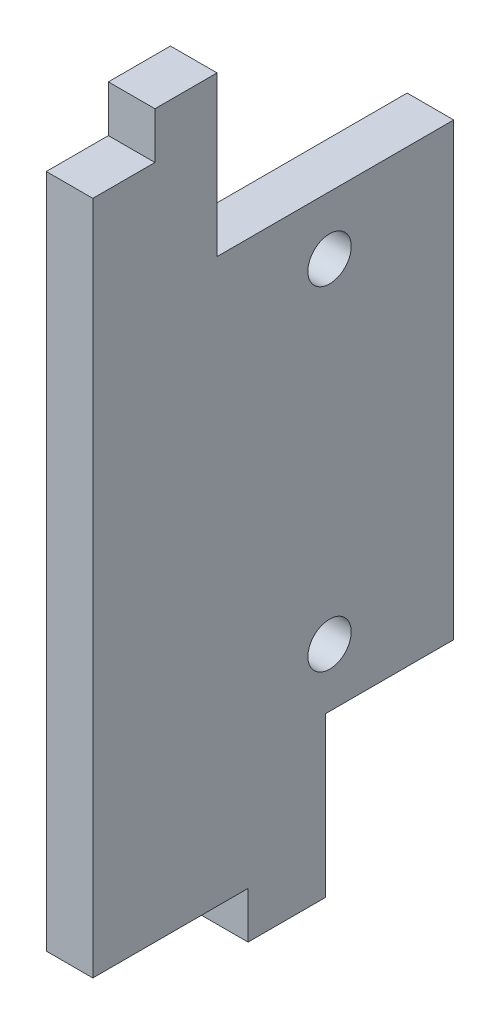
ISO-10303-21;
HEADER;
FILE_DESCRIPTION(('STEP AP214'),'2;1');
FILE_NAME('part.step','',(''),(''),'','','');
FILE_SCHEMA(('AUTOMOTIVE_DESIGN { 1 0 10303 214 1 1 1 1 }'));
ENDSEC;
DATA;
#1=APPLICATION_CONTEXT('core data for automotive mechanical design processes');
#2=APPLICATION_PROTOCOL_DEFINITION('international standard','automotive_design',2000,#1);
#3=PRODUCT_CONTEXT('',#1,'mechanical');
#4=PRODUCT('Part','Part','',(#3));
#5=PRODUCT_RELATED_PRODUCT_CATEGORY('part','',(#4));
#6=PRODUCT_DEFINITION_FORMATION('','',#4);
#7=PRODUCT_DEFINITION_CONTEXT('part definition',#1,'design');
#8=PRODUCT_DEFINITION('design','',#6,#7);
#9=PRODUCT_DEFINITION_SHAPE('','',#8);
#10=(LENGTH_UNIT() NAMED_UNIT(*) SI_UNIT(.MILLI.,.METRE.));
#11=(NAMED_UNIT(*) PLANE_ANGLE_UNIT() SI_UNIT($,.RADIAN.));
#12=(NAMED_UNIT(*) SI_UNIT($,.STERADIAN.) SOLID_ANGLE_UNIT());
#13=UNCERTAINTY_MEASURE_WITH_UNIT(LENGTH_MEASURE(1.E-05),#10,'distance_accuracy_value','');
#14=(GEOMETRIC_REPRESENTATION_CONTEXT(3) GLOBAL_UNCERTAINTY_ASSIGNED_CONTEXT((#13)) GLOBAL_UNIT_ASSIGNED_CONTEXT((#10,
#11,#12)) REPRESENTATION_CONTEXT('',''));
#15=CARTESIAN_POINT('',(0.,0.,0.));
#16=DIRECTION('',(0.,0.,1.));
#17=DIRECTION('',(1.,0.,0.));
#18=AXIS2_PLACEMENT_3D('',#15,#16,#17);
#19=CARTESIAN_POINT('',(3.,-24.75,-7.5));
#20=DIRECTION('',(0.,0.,1.));
#21=DIRECTION('',(1.,0.,0.));
#22=AXIS2_PLACEMENT_3D('',#19,#20,#21);
#23=PLANE('',#22);
#24=DIRECTION('',(-1.,0.,0.));
#25=VECTOR('',#24,1.);
#26=CARTESIAN_POINT('',(3.,-14.5,-7.5));
#27=LINE('',#26,#25);
#28=CARTESIAN_POINT('',(3.,-14.5,-7.5));
#29=VERTEX_POINT('',#28);
#30=CARTESIAN_POINT('',(0.,-14.5,-7.5));
#31=VERTEX_POINT('',#30);
#32=EDGE_CURVE('E52',#29,#31,#27,.T.);
#33=ORIENTED_EDGE('',*,*,#32,.F.);
#34=DIRECTION('',(0.,1.,0.));
#35=VECTOR('',#34,1.);
#36=CARTESIAN_POINT('',(3.,-24.75,-7.5));
#37=LINE('',#36,#35);
#38=CARTESIAN_POINT('',(3.,-24.75,-7.5));
#39=VERTEX_POINT('',#38);
#40=EDGE_CURVE('E151',#39,#29,#37,.T.);
#41=ORIENTED_EDGE('',*,*,#40,.F.);
#42=DIRECTION('',(-1.,0.,0.));
#43=VECTOR('',#42,1.);
#44=CARTESIAN_POINT('',(3.,-24.75,-7.5));
#45=LINE('',#44,#43);
#46=CARTESIAN_POINT('',(0.,-24.75,-7.5));
#47=VERTEX_POINT('',#46);
#48=EDGE_CURVE('E11',#39,#47,#45,.T.);
#49=ORIENTED_EDGE('',*,*,#48,.T.);
#50=DIRECTION('',(0.,1.,0.));
#51=VECTOR('',#50,1.);
#52=CARTESIAN_POINT('',(0.,-24.75,-7.5));
#53=LINE('',#52,#51);
#54=EDGE_CURVE('E218',#47,#31,#53,.T.);
#55=ORIENTED_EDGE('',*,*,#54,.T.);
#56=EDGE_LOOP('',(#33,#41,#49,#55));
#57=FACE_BOUND('',#56,.T.);
#58=ADVANCED_FACE('F37',(#57),#23,.F.);
#59=CARTESIAN_POINT('',(3.,-24.75,7.5));
#60=DIRECTION('',(0.,0.,-1.));
#61=DIRECTION('',(-1.,0.,0.));
#62=AXIS2_PLACEMENT_3D('',#59,#60,#61);
#63=PLANE('',#62);
#64=DIRECTION('',(0.,-1.,0.));
#65=VECTOR('',#64,1.);
#66=CARTESIAN_POINT('',(3.,-24.75,7.5));
#67=LINE('',#66,#65);
#68=CARTESIAN_POINT('',(3.,21.75,7.5));
#69=VERTEX_POINT('',#68);
#70=CARTESIAN_POINT('',(3.,-21.75,7.5));
#71=VERTEX_POINT('',#70);
#72=EDGE_CURVE('E205',#69,#71,#67,.T.);
#73=ORIENTED_EDGE('',*,*,#72,.F.);
#74=DIRECTION('',(-1.,0.,0.));
#75=VECTOR('',#74,1.);
#76=CARTESIAN_POINT('',(3.,21.75,7.5));
#77=LINE('',#76,#75);
#78=CARTESIAN_POINT('',(0.,21.75,7.5));
#79=VERTEX_POINT('',#78);
#80=EDGE_CURVE('E170',#69,#79,#77,.T.);
#81=ORIENTED_EDGE('',*,*,#80,.T.);
#82=DIRECTION('',(0.,-1.,0.));
#83=VECTOR('',#82,1.);
#84=CARTESIAN_POINT('',(0.,-24.75,7.5));
#85=LINE('',#84,#83);
#86=CARTESIAN_POINT('',(0.,-21.75,7.5));
#87=VERTEX_POINT('',#86);
#88=EDGE_CURVE('E203',#79,#87,#85,.T.);
#89=ORIENTED_EDGE('',*,*,#88,.T.);
#90=DIRECTION('',(-1.,0.,0.));
#91=VECTOR('',#90,1.);
#92=CARTESIAN_POINT('',(3.,-21.75,7.5));
#93=LINE('',#92,#91);
#94=EDGE_CURVE('E166',#71,#87,#93,.T.);
#95=ORIENTED_EDGE('',*,*,#94,.F.);
#96=EDGE_LOOP('',(#73,#81,#89,#95));
#97=FACE_BOUND('',#96,.T.);
#98=ADVANCED_FACE('F39',(#97),#63,.F.);
#99=CARTESIAN_POINT('',(3.,-24.75,7.5));
#100=DIRECTION('',(0.,1.,0.));
#101=DIRECTION('',(0.,0.,1.));
#102=AXIS2_PLACEMENT_3D('',#99,#100,#101);
#103=PLANE('',#102);
#104=DIRECTION('',(0.,0.,-1.));
#105=VECTOR('',#104,1.);
#106=CARTESIAN_POINT('',(3.,-24.75,7.5));
#107=LINE('',#106,#105);
#108=CARTESIAN_POINT('',(3.,-24.75,-2.5));
#109=VERTEX_POINT('',#108);
#110=EDGE_CURVE('E208',#109,#39,#107,.T.);
#111=ORIENTED_EDGE('',*,*,#110,.F.);
#112=DIRECTION('',(-1.,0.,0.));
#113=VECTOR('',#112,1.);
#114=CARTESIAN_POINT('',(3.,-24.75,-2.5));
#115=LINE('',#114,#113);
#116=CARTESIAN_POINT('',(0.,-24.75,-2.5));
#117=VERTEX_POINT('',#116);
#118=EDGE_CURVE('E172',#109,#117,#115,.T.);
#119=ORIENTED_EDGE('',*,*,#118,.T.);
#120=DIRECTION('',(0.,0.,-1.));
#121=VECTOR('',#120,1.);
#122=CARTESIAN_POINT('',(0.,-24.75,7.5));
#123=LINE('',#122,#121);
#124=EDGE_CURVE('E216',#117,#47,#123,.T.);
#125=ORIENTED_EDGE('',*,*,#124,.T.);
#126=ORIENTED_EDGE('',*,*,#48,.F.);
#127=EDGE_LOOP('',(#111,#119,#125,#126));
#128=FACE_BOUND('',#127,.T.);
#129=ADVANCED_FACE('F280',(#128),#103,.F.);
#130=CARTESIAN_POINT('',(3.,24.75,7.5));
#131=DIRECTION('',(0.,-1.,0.));
#132=DIRECTION('',(0.,0.,-1.));
#133=AXIS2_PLACEMENT_3D('',#130,#131,#132);
#134=PLANE('',#133);
#135=DIRECTION('',(0.,0.,1.));
#136=VECTOR('',#135,1.);
#137=CARTESIAN_POINT('',(0.,24.75,7.5));
#138=LINE('',#137,#136);
#139=CARTESIAN_POINT('',(0.,24.75,-0.5));
#140=VERTEX_POINT('',#139);
#141=CARTESIAN_POINT('',(0.,24.75,3.5));
#142=VERTEX_POINT('',#141);
#143=EDGE_CURVE('E209',#140,#142,#138,.T.);
#144=ORIENTED_EDGE('',*,*,#143,.T.);
#145=DIRECTION('',(-1.,0.,0.));
#146=VECTOR('',#145,1.);
#147=CARTESIAN_POINT('',(3.,24.75,3.5));
#148=LINE('',#147,#146);
#149=CARTESIAN_POINT('',(3.,24.75,3.5));
#150=VERTEX_POINT('',#149);
#151=EDGE_CURVE('E60',#150,#142,#148,.T.);
#152=ORIENTED_EDGE('',*,*,#151,.F.);
#153=DIRECTION('',(0.,0.,1.));
#154=VECTOR('',#153,1.);
#155=CARTESIAN_POINT('',(3.,24.75,7.5));
#156=LINE('',#155,#154);
#157=CARTESIAN_POINT('',(3.,24.75,-0.5));
#158=VERTEX_POINT('',#157);
#159=EDGE_CURVE('E45',#158,#150,#156,.T.);
#160=ORIENTED_EDGE('',*,*,#159,.F.);
#161=DIRECTION('',(-1.,0.,0.));
#162=VECTOR('',#161,1.);
#163=CARTESIAN_POINT('',(3.,24.75,-0.5));
#164=LINE('',#163,#162);
#165=EDGE_CURVE('E200',#158,#140,#164,.T.);
#166=ORIENTED_EDGE('',*,*,#165,.T.);
#167=EDGE_LOOP('',(#144,#152,#160,#166));
#168=FACE_BOUND('',#167,.T.);
#169=ADVANCED_FACE('F222',(#168),#134,.F.);
#170=CARTESIAN_POINT('',(3.,0.,0.));
#171=DIRECTION('',(-1.,0.,0.));
#172=DIRECTION('',(0.,0.,1.));
#173=AXIS2_PLACEMENT_3D('',#170,#171,#172);
#174=PLANE('',#173);
#175=CARTESIAN_POINT('',(3.,10.75,-7.7499999999999));
#176=DIRECTION('',(-1.,0.,0.));
#177=DIRECTION('',(0.,0.,1.));
#178=AXIS2_PLACEMENT_3D('',#175,#176,#177);
#179=CIRCLE('',#178,1.39699999999999);
#180=CARTESIAN_POINT('',(3.,10.75,-6.3529999999999));
#181=VERTEX_POINT('',#180);
#182=EDGE_CURVE('E248',#181,#181,#179,.T.);
#183=ORIENTED_EDGE('',*,*,#182,.T.);
#184=EDGE_LOOP('',(#183));
#185=FACE_BOUND('',#184,.T.);
#186=CARTESIAN_POINT('',(3.,-10.75,-7.74999999999991));
#187=DIRECTION('',(-1.,0.,0.));
#188=DIRECTION('',(0.,0.,1.));
#189=AXIS2_PLACEMENT_3D('',#186,#187,#188);
#190=CIRCLE('',#189,1.39699999999999);
#191=CARTESIAN_POINT('',(3.,-10.75,-6.35299999999992));
#192=VERTEX_POINT('',#191);
#193=EDGE_CURVE('E241',#192,#192,#190,.T.);
#194=ORIENTED_EDGE('',*,*,#193,.T.);
#195=EDGE_LOOP('',(#194));
#196=FACE_BOUND('',#195,.T.);
#197=DIRECTION('',(0.,-1.,0.));
#198=VECTOR('',#197,1.);
#199=CARTESIAN_POINT('',(3.,24.75,3.5));
#200=LINE('',#199,#198);
#201=CARTESIAN_POINT('',(3.,21.75,3.5));
#202=VERTEX_POINT('',#201);
#203=EDGE_CURVE('E179',#150,#202,#200,.T.);
#204=ORIENTED_EDGE('',*,*,#203,.T.);
#205=DIRECTION('',(0.,0.,1.));
#206=VECTOR('',#205,1.);
#207=CARTESIAN_POINT('',(3.,21.75,7.5));
#208=LINE('',#207,#206);
#209=EDGE_CURVE('E181',#202,#69,#208,.T.);
#210=ORIENTED_EDGE('',*,*,#209,.T.);
#211=ORIENTED_EDGE('',*,*,#72,.T.);
#212=DIRECTION('',(0.,0.,-1.));
#213=VECTOR('',#212,1.);
#214=CARTESIAN_POINT('',(3.,-21.75,7.5));
#215=LINE('',#214,#213);
#216=CARTESIAN_POINT('',(3.,-21.75,-2.5));
#217=VERTEX_POINT('',#216);
#218=EDGE_CURVE('E159',#71,#217,#215,.T.);
#219=ORIENTED_EDGE('',*,*,#218,.T.);
#220=DIRECTION('',(0.,-1.,0.));
#221=VECTOR('',#220,1.);
#222=CARTESIAN_POINT('',(3.,-24.75,-2.5));
#223=LINE('',#222,#221);
#224=EDGE_CURVE('E162',#217,#109,#223,.T.);
#225=ORIENTED_EDGE('',*,*,#224,.T.);
#226=ORIENTED_EDGE('',*,*,#110,.T.);
#227=ORIENTED_EDGE('',*,*,#40,.T.);
#228=DIRECTION('',(0.,0.,1.));
#229=VECTOR('',#228,1.);
#230=CARTESIAN_POINT('',(3.,-14.5,-15.75));
#231=LINE('',#230,#229);
#232=CARTESIAN_POINT('',(3.,-14.5,-15.75));
#233=VERTEX_POINT('',#232);
#234=EDGE_CURVE('E132',#233,#29,#231,.T.);
#235=ORIENTED_EDGE('',*,*,#234,.F.);
#236=DIRECTION('',(0.,-1.,0.));
#237=VECTOR('',#236,1.);
#238=CARTESIAN_POINT('',(3.,14.5,-15.75));
#239=LINE('',#238,#237);
#240=CARTESIAN_POINT('',(3.,14.5,-15.75));
#241=VERTEX_POINT('',#240);
#242=EDGE_CURVE('E139',#241,#233,#239,.T.);
#243=ORIENTED_EDGE('',*,*,#242,.F.);
#244=DIRECTION('',(0.,0.,1.));
#245=VECTOR('',#244,1.);
#246=CARTESIAN_POINT('',(3.,14.5,-7.5));
#247=LINE('',#246,#245);
#248=CARTESIAN_POINT('',(3.,14.5,-0.5));
#249=VERTEX_POINT('',#248);
#250=EDGE_CURVE('E190',#241,#249,#247,.T.);
#251=ORIENTED_EDGE('',*,*,#250,.T.);
#252=DIRECTION('',(0.,1.,0.));
#253=VECTOR('',#252,1.);
#254=CARTESIAN_POINT('',(3.,24.75,-0.5));
#255=LINE('',#254,#253);
#256=EDGE_CURVE('E192',#249,#158,#255,.T.);
#257=ORIENTED_EDGE('',*,*,#256,.T.);
#258=ORIENTED_EDGE('',*,*,#159,.T.);
#259=EDGE_LOOP('',(#204,#210,#211,#219,#225,#226,#227,#235,#243,#251,#257,#258));
#260=FACE_BOUND('',#259,.T.);
#261=ADVANCED_FACE('F150',(#185,#196,#260),#174,.F.);
#262=CARTESIAN_POINT('',(0.,0.,0.));
#263=DIRECTION('',(-1.,0.,0.));
#264=DIRECTION('',(0.,0.,1.));
#265=AXIS2_PLACEMENT_3D('',#262,#263,#264);
#266=PLANE('',#265);
#267=CARTESIAN_POINT('',(0.,10.75,-7.7499999999999));
#268=DIRECTION('',(-1.,0.,0.));
#269=DIRECTION('',(0.,0.,1.));
#270=AXIS2_PLACEMENT_3D('',#267,#268,#269);
#271=CIRCLE('',#270,1.39699999999999);
#272=CARTESIAN_POINT('',(0.,10.75,-6.35299999999991));
#273=VERTEX_POINT('',#272);
#274=EDGE_CURVE('E253',#273,#273,#271,.T.);
#275=ORIENTED_EDGE('',*,*,#274,.F.);
#276=EDGE_LOOP('',(#275));
#277=FACE_BOUND('',#276,.T.);
#278=CARTESIAN_POINT('',(0.,-10.75,-7.74999999999991));
#279=DIRECTION('',(-1.,0.,0.));
#280=DIRECTION('',(0.,0.,1.));
#281=AXIS2_PLACEMENT_3D('',#278,#279,#280);
#282=CIRCLE('',#281,1.39699999999999);
#283=CARTESIAN_POINT('',(0.,-10.75,-6.35299999999992));
#284=VERTEX_POINT('',#283);
#285=EDGE_CURVE('E243',#284,#284,#282,.T.);
#286=ORIENTED_EDGE('',*,*,#285,.F.);
#287=EDGE_LOOP('',(#286));
#288=FACE_BOUND('',#287,.T.);
#289=DIRECTION('',(0.,0.,1.));
#290=VECTOR('',#289,1.);
#291=CARTESIAN_POINT('',(0.,21.75,7.5));
#292=LINE('',#291,#290);
#293=CARTESIAN_POINT('',(0.,21.75,3.5));
#294=VERTEX_POINT('',#293);
#295=EDGE_CURVE('E154',#294,#79,#292,.T.);
#296=ORIENTED_EDGE('',*,*,#295,.F.);
#297=DIRECTION('',(0.,-1.,0.));
#298=VECTOR('',#297,1.);
#299=CARTESIAN_POINT('',(0.,24.75,3.5));
#300=LINE('',#299,#298);
#301=EDGE_CURVE('E152',#142,#294,#300,.T.);
#302=ORIENTED_EDGE('',*,*,#301,.F.);
#303=ORIENTED_EDGE('',*,*,#143,.F.);
#304=DIRECTION('',(0.,1.,0.));
#305=VECTOR('',#304,1.);
#306=CARTESIAN_POINT('',(0.,24.75,-0.5));
#307=LINE('',#306,#305);
#308=CARTESIAN_POINT('',(0.,14.5,-0.5));
#309=VERTEX_POINT('',#308);
#310=EDGE_CURVE('E193',#309,#140,#307,.T.);
#311=ORIENTED_EDGE('',*,*,#310,.F.);
#312=DIRECTION('',(0.,0.,1.));
#313=VECTOR('',#312,1.);
#314=CARTESIAN_POINT('',(0.,14.5,-7.5));
#315=LINE('',#314,#313);
#316=CARTESIAN_POINT('',(0.,14.5,-15.75));
#317=VERTEX_POINT('',#316);
#318=EDGE_CURVE('E175',#317,#309,#315,.T.);
#319=ORIENTED_EDGE('',*,*,#318,.F.);
#320=DIRECTION('',(0.,1.,0.));
#321=VECTOR('',#320,1.);
#322=CARTESIAN_POINT('',(0.,14.5,-15.75));
#323=LINE('',#322,#321);
#324=CARTESIAN_POINT('',(0.,-14.5,-15.75));
#325=VERTEX_POINT('',#324);
#326=EDGE_CURVE('E138',#325,#317,#323,.T.);
#327=ORIENTED_EDGE('',*,*,#326,.F.);
#328=DIRECTION('',(0.,0.,1.));
#329=VECTOR('',#328,1.);
#330=CARTESIAN_POINT('',(0.,-14.5,-15.75));
#331=LINE('',#330,#329);
#332=EDGE_CURVE('E134',#325,#31,#331,.T.);
#333=ORIENTED_EDGE('',*,*,#332,.T.);
#334=ORIENTED_EDGE('',*,*,#54,.F.);
#335=ORIENTED_EDGE('',*,*,#124,.F.);
#336=DIRECTION('',(0.,-1.,0.));
#337=VECTOR('',#336,1.);
#338=CARTESIAN_POINT('',(0.,-24.75,-2.5));
#339=LINE('',#338,#337);
#340=CARTESIAN_POINT('',(0.,-21.75,-2.5));
#341=VERTEX_POINT('',#340);
#342=EDGE_CURVE('E163',#341,#117,#339,.T.);
#343=ORIENTED_EDGE('',*,*,#342,.F.);
#344=DIRECTION('',(0.,0.,-1.));
#345=VECTOR('',#344,1.);
#346=CARTESIAN_POINT('',(0.,-21.75,7.5));
#347=LINE('',#346,#345);
#348=EDGE_CURVE('E167',#87,#341,#347,.T.);
#349=ORIENTED_EDGE('',*,*,#348,.F.);
#350=ORIENTED_EDGE('',*,*,#88,.F.);
#351=EDGE_LOOP('',(#296,#302,#303,#311,#319,#327,#333,#334,#335,#343,#349,#350));
#352=FACE_BOUND('',#351,.T.);
#353=ADVANCED_FACE('F227',(#277,#288,#352),#266,.T.);
#354=CARTESIAN_POINT('',(3.,24.75,-0.5));
#355=DIRECTION('',(0.,0.,1.));
#356=DIRECTION('',(0.,-1.,0.));
#357=AXIS2_PLACEMENT_3D('',#354,#355,#356);
#358=PLANE('',#357);
#359=ORIENTED_EDGE('',*,*,#310,.T.);
#360=ORIENTED_EDGE('',*,*,#165,.F.);
#361=ORIENTED_EDGE('',*,*,#256,.F.);
#362=DIRECTION('',(-1.,0.,0.));
#363=VECTOR('',#362,1.);
#364=CARTESIAN_POINT('',(3.,14.5,-0.5));
#365=LINE('',#364,#363);
#366=EDGE_CURVE('E196',#249,#309,#365,.T.);
#367=ORIENTED_EDGE('',*,*,#366,.T.);
#368=EDGE_LOOP('',(#359,#360,#361,#367));
#369=FACE_BOUND('',#368,.T.);
#370=ADVANCED_FACE('F236',(#369),#358,.F.);
#371=CARTESIAN_POINT('',(3.,14.5,-7.5));
#372=DIRECTION('',(0.,-1.,0.));
#373=DIRECTION('',(0.,0.,-1.));
#374=AXIS2_PLACEMENT_3D('',#371,#372,#373);
#375=PLANE('',#374);
#376=ORIENTED_EDGE('',*,*,#318,.T.);
#377=ORIENTED_EDGE('',*,*,#366,.F.);
#378=ORIENTED_EDGE('',*,*,#250,.F.);
#379=DIRECTION('',(1.,0.,0.));
#380=VECTOR('',#379,1.);
#381=CARTESIAN_POINT('',(3.,14.5,-15.75));
#382=LINE('',#381,#380);
#383=EDGE_CURVE('E145',#317,#241,#382,.T.);
#384=ORIENTED_EDGE('',*,*,#383,.F.);
#385=EDGE_LOOP('',(#376,#377,#378,#384));
#386=FACE_BOUND('',#385,.T.);
#387=ADVANCED_FACE('F238',(#386),#375,.F.);
#388=CARTESIAN_POINT('',(3.,-24.75,-2.5));
#389=DIRECTION('',(0.,0.,-1.));
#390=DIRECTION('',(0.,1.,0.));
#391=AXIS2_PLACEMENT_3D('',#388,#389,#390);
#392=PLANE('',#391);
#393=ORIENTED_EDGE('',*,*,#342,.T.);
#394=ORIENTED_EDGE('',*,*,#118,.F.);
#395=ORIENTED_EDGE('',*,*,#224,.F.);
#396=DIRECTION('',(-1.,0.,0.));
#397=VECTOR('',#396,1.);
#398=CARTESIAN_POINT('',(3.,-21.75,-2.5));
#399=LINE('',#398,#397);
#400=EDGE_CURVE('E176',#217,#341,#399,.T.);
#401=ORIENTED_EDGE('',*,*,#400,.T.);
#402=EDGE_LOOP('',(#393,#394,#395,#401));
#403=FACE_BOUND('',#402,.T.);
#404=ADVANCED_FACE('F293',(#403),#392,.F.);
#405=CARTESIAN_POINT('',(3.,-21.75,7.5));
#406=DIRECTION('',(0.,1.,0.));
#407=DIRECTION('',(0.,0.,1.));
#408=AXIS2_PLACEMENT_3D('',#405,#406,#407);
#409=PLANE('',#408);
#410=ORIENTED_EDGE('',*,*,#348,.T.);
#411=ORIENTED_EDGE('',*,*,#400,.F.);
#412=ORIENTED_EDGE('',*,*,#218,.F.);
#413=ORIENTED_EDGE('',*,*,#94,.T.);
#414=EDGE_LOOP('',(#410,#411,#412,#413));
#415=FACE_BOUND('',#414,.T.);
#416=ADVANCED_FACE('F299',(#415),#409,.F.);
#417=CARTESIAN_POINT('',(3.,21.75,7.5));
#418=DIRECTION('',(0.,-1.,0.));
#419=DIRECTION('',(0.,0.,-1.));
#420=AXIS2_PLACEMENT_3D('',#417,#418,#419);
#421=PLANE('',#420);
#422=ORIENTED_EDGE('',*,*,#295,.T.);
#423=ORIENTED_EDGE('',*,*,#80,.F.);
#424=ORIENTED_EDGE('',*,*,#209,.F.);
#425=DIRECTION('',(-1.,0.,0.));
#426=VECTOR('',#425,1.);
#427=CARTESIAN_POINT('',(3.,21.75,3.5));
#428=LINE('',#427,#426);
#429=EDGE_CURVE('E187',#202,#294,#428,.T.);
#430=ORIENTED_EDGE('',*,*,#429,.T.);
#431=EDGE_LOOP('',(#422,#423,#424,#430));
#432=FACE_BOUND('',#431,.T.);
#433=ADVANCED_FACE('F232',(#432),#421,.F.);
#434=CARTESIAN_POINT('',(3.,24.75,3.5));
#435=DIRECTION('',(0.,0.,-1.));
#436=DIRECTION('',(-1.,0.,0.));
#437=AXIS2_PLACEMENT_3D('',#434,#435,#436);
#438=PLANE('',#437);
#439=ORIENTED_EDGE('',*,*,#301,.T.);
#440=ORIENTED_EDGE('',*,*,#429,.F.);
#441=ORIENTED_EDGE('',*,*,#203,.F.);
#442=ORIENTED_EDGE('',*,*,#151,.T.);
#443=EDGE_LOOP('',(#439,#440,#441,#442));
#444=FACE_BOUND('',#443,.T.);
#445=ADVANCED_FACE('F229',(#444),#438,.F.);
#446=CARTESIAN_POINT('',(3.,-14.5,-15.75));
#447=DIRECTION('',(0.,1.,0.));
#448=DIRECTION('',(0.,0.,1.));
#449=AXIS2_PLACEMENT_3D('',#446,#447,#448);
#450=PLANE('',#449);
#451=ORIENTED_EDGE('',*,*,#32,.T.);
#452=ORIENTED_EDGE('',*,*,#332,.F.);
#453=DIRECTION('',(-1.,0.,0.));
#454=VECTOR('',#453,1.);
#455=CARTESIAN_POINT('',(3.,-14.5,-15.75));
#456=LINE('',#455,#454);
#457=EDGE_CURVE('E128',#233,#325,#456,.T.);
#458=ORIENTED_EDGE('',*,*,#457,.F.);
#459=ORIENTED_EDGE('',*,*,#234,.T.);
#460=EDGE_LOOP('',(#451,#452,#458,#459));
#461=FACE_BOUND('',#460,.T.);
#462=ADVANCED_FACE('F130',(#461),#450,.F.);
#463=CARTESIAN_POINT('',(0.,0.,-15.75));
#464=DIRECTION('',(0.,0.,-1.));
#465=DIRECTION('',(-1.,0.,0.));
#466=AXIS2_PLACEMENT_3D('',#463,#464,#465);
#467=PLANE('',#466);
#468=ORIENTED_EDGE('',*,*,#242,.T.);
#469=ORIENTED_EDGE('',*,*,#457,.T.);
#470=ORIENTED_EDGE('',*,*,#326,.T.);
#471=ORIENTED_EDGE('',*,*,#383,.T.);
#472=EDGE_LOOP('',(#468,#469,#470,#471));
#473=FACE_BOUND('',#472,.T.);
#474=ADVANCED_FACE('F143',(#473),#467,.T.);
#475=CARTESIAN_POINT('',(0.,-10.75,-7.74999999999991));
#476=DIRECTION('',(-1.,0.,0.));
#477=DIRECTION('',(0.,0.,1.));
#478=AXIS2_PLACEMENT_3D('',#475,#476,#477);
#479=CYLINDRICAL_SURFACE('',#478,1.39699999999999);
#480=ORIENTED_EDGE('',*,*,#193,.F.);
#481=EDGE_LOOP('',(#480));
#482=FACE_BOUND('',#481,.T.);
#483=ORIENTED_EDGE('',*,*,#285,.T.);
#484=EDGE_LOOP('',(#483));
#485=FACE_BOUND('',#484,.T.);
#486=ADVANCED_FACE('F264',(#482,#485),#479,.F.);
#487=CARTESIAN_POINT('',(0.,10.75,-7.7499999999999));
#488=DIRECTION('',(-1.,0.,0.));
#489=DIRECTION('',(0.,0.,1.));
#490=AXIS2_PLACEMENT_3D('',#487,#488,#489);
#491=CYLINDRICAL_SURFACE('',#490,1.39699999999999);
#492=ORIENTED_EDGE('',*,*,#182,.F.);
#493=EDGE_LOOP('',(#492));
#494=FACE_BOUND('',#493,.T.);
#495=ORIENTED_EDGE('',*,*,#274,.T.);
#496=EDGE_LOOP('',(#495));
#497=FACE_BOUND('',#496,.T.);
#498=ADVANCED_FACE('F257',(#494,#497),#491,.F.);
#499=CLOSED_SHELL('',(#58,#98,#129,#169,#261,#353,#370,#387,#404,#416,#433,#445,#462,#474,#486,#498));
#500=MANIFOLD_SOLID_BREP('B2',#499);
#501=ADVANCED_BREP_SHAPE_REPRESENTATION('',(#18,#500),#14);
#502=SHAPE_DEFINITION_REPRESENTATION(#9,#501);
ENDSEC;
END-ISO-10303-21;
